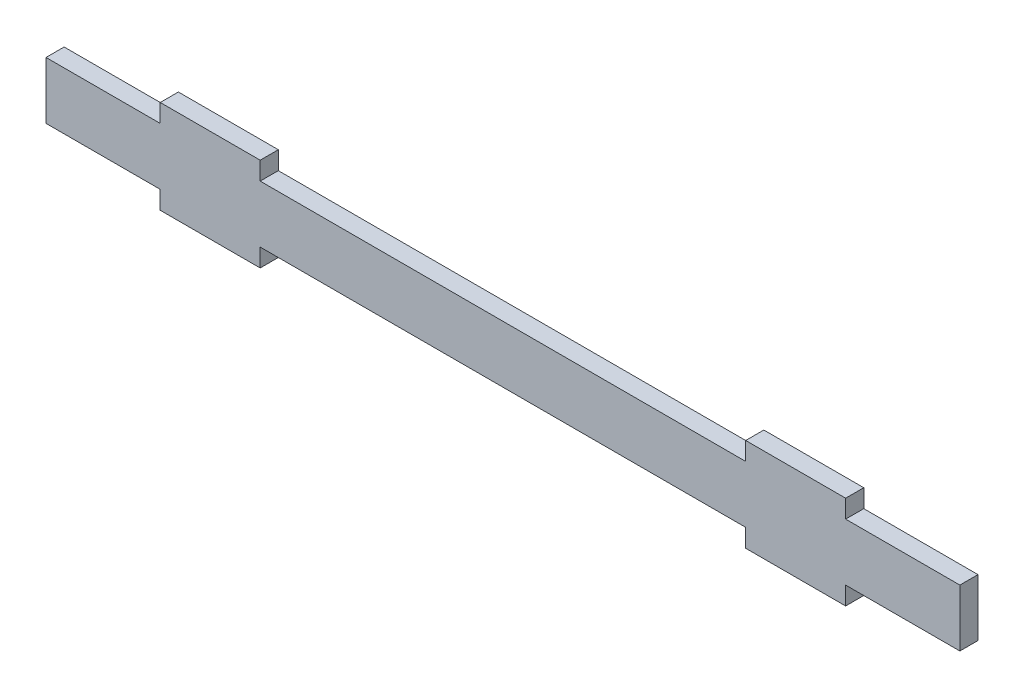
ISO-10303-21;
HEADER;
FILE_DESCRIPTION(('STEP AP214'),'2;1');
FILE_NAME('part.step','',(''),(''),'','','');
FILE_SCHEMA(('AUTOMOTIVE_DESIGN { 1 0 10303 214 1 1 1 1 }'));
ENDSEC;
DATA;
#1=APPLICATION_CONTEXT('core data for automotive mechanical design processes');
#2=APPLICATION_PROTOCOL_DEFINITION('international standard','automotive_design',2000,#1);
#3=PRODUCT_CONTEXT('',#1,'mechanical');
#4=PRODUCT('Part','Part','',(#3));
#5=PRODUCT_RELATED_PRODUCT_CATEGORY('part','',(#4));
#6=PRODUCT_DEFINITION_FORMATION('','',#4);
#7=PRODUCT_DEFINITION_CONTEXT('part definition',#1,'design');
#8=PRODUCT_DEFINITION('design','',#6,#7);
#9=PRODUCT_DEFINITION_SHAPE('','',#8);
#10=(LENGTH_UNIT() NAMED_UNIT(*) SI_UNIT(.MILLI.,.METRE.));
#11=(NAMED_UNIT(*) PLANE_ANGLE_UNIT() SI_UNIT($,.RADIAN.));
#12=(NAMED_UNIT(*) SI_UNIT($,.STERADIAN.) SOLID_ANGLE_UNIT());
#13=UNCERTAINTY_MEASURE_WITH_UNIT(LENGTH_MEASURE(1.E-05),#10,'distance_accuracy_value','');
#14=(GEOMETRIC_REPRESENTATION_CONTEXT(3) GLOBAL_UNCERTAINTY_ASSIGNED_CONTEXT((#13)) GLOBAL_UNIT_ASSIGNED_CONTEXT((#10,
#11,#12)) REPRESENTATION_CONTEXT('',''));
#15=CARTESIAN_POINT('',(0.,0.,0.));
#16=DIRECTION('',(0.,0.,1.));
#17=DIRECTION('',(1.,0.,0.));
#18=AXIS2_PLACEMENT_3D('',#15,#16,#17);
#19=CARTESIAN_POINT('',(-160.,-4.99999999999996,6.35));
#20=DIRECTION('',(1.,0.,0.));
#21=DIRECTION('',(0.,0.,-1.));
#22=AXIS2_PLACEMENT_3D('',#19,#20,#21);
#23=PLANE('',#22);
#24=DIRECTION('',(0.,-1.,0.));
#25=VECTOR('',#24,1.);
#26=CARTESIAN_POINT('',(-160.,-4.99999999999996,0.));
#27=LINE('',#26,#25);
#28=CARTESIAN_POINT('',(-160.,14.9999999999999,0.));
#29=VERTEX_POINT('',#28);
#30=CARTESIAN_POINT('',(-160.,-4.99999999999996,0.));
#31=VERTEX_POINT('',#30);
#32=EDGE_CURVE('E201',#29,#31,#27,.T.);
#33=ORIENTED_EDGE('',*,*,#32,.T.);
#34=DIRECTION('',(0.,0.,-1.));
#35=VECTOR('',#34,1.);
#36=CARTESIAN_POINT('',(-160.,-4.99999999999996,6.35));
#37=LINE('',#36,#35);
#38=CARTESIAN_POINT('',(-160.,-4.99999999999996,6.35));
#39=VERTEX_POINT('',#38);
#40=EDGE_CURVE('E11',#39,#31,#37,.T.);
#41=ORIENTED_EDGE('',*,*,#40,.F.);
#42=DIRECTION('',(0.,-1.,0.));
#43=VECTOR('',#42,1.);
#44=CARTESIAN_POINT('',(-160.,-4.99999999999996,6.35));
#45=LINE('',#44,#43);
#46=CARTESIAN_POINT('',(-160.,14.9999999999999,6.35));
#47=VERTEX_POINT('',#46);
#48=EDGE_CURVE('E239',#47,#39,#45,.T.);
#49=ORIENTED_EDGE('',*,*,#48,.F.);
#50=DIRECTION('',(0.,0.,-1.));
#51=VECTOR('',#50,1.);
#52=CARTESIAN_POINT('',(-160.,14.9999999999999,6.35));
#53=LINE('',#52,#51);
#54=EDGE_CURVE('E197',#47,#29,#53,.T.);
#55=ORIENTED_EDGE('',*,*,#54,.T.);
#56=EDGE_LOOP('',(#33,#41,#49,#55));
#57=FACE_BOUND('',#56,.T.);
#58=ADVANCED_FACE('F33',(#57),#23,.F.);
#59=CARTESIAN_POINT('',(-160.,-4.99999999999996,6.35));
#60=DIRECTION('',(0.,1.,0.));
#61=DIRECTION('',(0.,0.,1.));
#62=AXIS2_PLACEMENT_3D('',#59,#60,#61);
#63=PLANE('',#62);
#64=DIRECTION('',(1.,0.,0.));
#65=VECTOR('',#64,1.);
#66=CARTESIAN_POINT('',(-160.,-4.99999999999996,0.));
#67=LINE('',#66,#65);
#68=CARTESIAN_POINT('',(-120.,-4.99999999999996,0.));
#69=VERTEX_POINT('',#68);
#70=EDGE_CURVE('E204',#31,#69,#67,.T.);
#71=ORIENTED_EDGE('',*,*,#70,.T.);
#72=DIRECTION('',(0.,0.,-1.));
#73=VECTOR('',#72,1.);
#74=CARTESIAN_POINT('',(-120.,-4.99999999999996,6.35));
#75=LINE('',#74,#73);
#76=CARTESIAN_POINT('',(-120.,-4.99999999999996,6.35));
#77=VERTEX_POINT('',#76);
#78=EDGE_CURVE('E41',#77,#69,#75,.T.);
#79=ORIENTED_EDGE('',*,*,#78,.F.);
#80=DIRECTION('',(1.,0.,0.));
#81=VECTOR('',#80,1.);
#82=CARTESIAN_POINT('',(-160.,-4.99999999999996,6.35));
#83=LINE('',#82,#81);
#84=EDGE_CURVE('E128',#39,#77,#83,.T.);
#85=ORIENTED_EDGE('',*,*,#84,.F.);
#86=ORIENTED_EDGE('',*,*,#40,.T.);
#87=EDGE_LOOP('',(#71,#79,#85,#86));
#88=FACE_BOUND('',#87,.T.);
#89=ADVANCED_FACE('F357',(#88),#63,.F.);
#90=CARTESIAN_POINT('',(-120.,-11.35,6.35));
#91=DIRECTION('',(1.,0.,0.));
#92=DIRECTION('',(0.,0.,-1.));
#93=AXIS2_PLACEMENT_3D('',#90,#91,#92);
#94=PLANE('',#93);
#95=DIRECTION('',(0.,-1.,0.));
#96=VECTOR('',#95,1.);
#97=CARTESIAN_POINT('',(-120.,-11.35,0.));
#98=LINE('',#97,#96);
#99=CARTESIAN_POINT('',(-120.,-11.35,0.));
#100=VERTEX_POINT('',#99);
#101=EDGE_CURVE('E206',#69,#100,#98,.T.);
#102=ORIENTED_EDGE('',*,*,#101,.T.);
#103=DIRECTION('',(0.,0.,-1.));
#104=VECTOR('',#103,1.);
#105=CARTESIAN_POINT('',(-120.,-11.35,6.35));
#106=LINE('',#105,#104);
#107=CARTESIAN_POINT('',(-120.,-11.35,6.35));
#108=VERTEX_POINT('',#107);
#109=EDGE_CURVE('E282',#108,#100,#106,.T.);
#110=ORIENTED_EDGE('',*,*,#109,.F.);
#111=DIRECTION('',(0.,-1.,0.));
#112=VECTOR('',#111,1.);
#113=CARTESIAN_POINT('',(-120.,-11.35,6.35));
#114=LINE('',#113,#112);
#115=EDGE_CURVE('E290',#77,#108,#114,.T.);
#116=ORIENTED_EDGE('',*,*,#115,.F.);
#117=ORIENTED_EDGE('',*,*,#78,.T.);
#118=EDGE_LOOP('',(#102,#110,#116,#117));
#119=FACE_BOUND('',#118,.T.);
#120=ADVANCED_FACE('F288',(#119),#94,.F.);
#121=CARTESIAN_POINT('',(-85.,-11.35,6.35));
#122=DIRECTION('',(0.,1.,0.));
#123=DIRECTION('',(-1.,0.,0.));
#124=AXIS2_PLACEMENT_3D('',#121,#122,#123);
#125=PLANE('',#124);
#126=DIRECTION('',(1.,0.,0.));
#127=VECTOR('',#126,1.);
#128=CARTESIAN_POINT('',(-85.,-11.35,0.));
#129=LINE('',#128,#127);
#130=CARTESIAN_POINT('',(-85.,-11.35,0.));
#131=VERTEX_POINT('',#130);
#132=EDGE_CURVE('E208',#100,#131,#129,.T.);
#133=ORIENTED_EDGE('',*,*,#132,.T.);
#134=DIRECTION('',(0.,0.,-1.));
#135=VECTOR('',#134,1.);
#136=CARTESIAN_POINT('',(-85.,-11.35,6.35));
#137=LINE('',#136,#135);
#138=CARTESIAN_POINT('',(-85.,-11.35,6.35));
#139=VERTEX_POINT('',#138);
#140=EDGE_CURVE('E279',#139,#131,#137,.T.);
#141=ORIENTED_EDGE('',*,*,#140,.F.);
#142=DIRECTION('',(1.,0.,0.));
#143=VECTOR('',#142,1.);
#144=CARTESIAN_POINT('',(-85.,-11.35,6.35));
#145=LINE('',#144,#143);
#146=EDGE_CURVE('E308',#108,#139,#145,.T.);
#147=ORIENTED_EDGE('',*,*,#146,.F.);
#148=ORIENTED_EDGE('',*,*,#109,.T.);
#149=EDGE_LOOP('',(#133,#141,#147,#148));
#150=FACE_BOUND('',#149,.T.);
#151=ADVANCED_FACE('F299',(#150),#125,.F.);
#152=CARTESIAN_POINT('',(-85.,-4.99999999999996,6.35));
#153=DIRECTION('',(-1.,0.,0.));
#154=DIRECTION('',(0.,0.,1.));
#155=AXIS2_PLACEMENT_3D('',#152,#153,#154);
#156=PLANE('',#155);
#157=DIRECTION('',(0.,1.,0.));
#158=VECTOR('',#157,1.);
#159=CARTESIAN_POINT('',(-85.,-4.99999999999996,0.));
#160=LINE('',#159,#158);
#161=CARTESIAN_POINT('',(-85.,-4.99999999999996,0.));
#162=VERTEX_POINT('',#161);
#163=EDGE_CURVE('E210',#131,#162,#160,.T.);
#164=ORIENTED_EDGE('',*,*,#163,.T.);
#165=DIRECTION('',(0.,0.,-1.));
#166=VECTOR('',#165,1.);
#167=CARTESIAN_POINT('',(-85.,-4.99999999999996,6.35));
#168=LINE('',#167,#166);
#169=CARTESIAN_POINT('',(-85.,-4.99999999999996,6.35));
#170=VERTEX_POINT('',#169);
#171=EDGE_CURVE('E276',#170,#162,#168,.T.);
#172=ORIENTED_EDGE('',*,*,#171,.F.);
#173=DIRECTION('',(0.,1.,0.));
#174=VECTOR('',#173,1.);
#175=CARTESIAN_POINT('',(-85.,-4.99999999999996,6.35));
#176=LINE('',#175,#174);
#177=EDGE_CURVE('E305',#139,#170,#176,.T.);
#178=ORIENTED_EDGE('',*,*,#177,.F.);
#179=ORIENTED_EDGE('',*,*,#140,.T.);
#180=EDGE_LOOP('',(#164,#172,#178,#179));
#181=FACE_BOUND('',#180,.T.);
#182=ADVANCED_FACE('F303',(#181),#156,.F.);
#183=CARTESIAN_POINT('',(-85.,-4.99999999999996,6.35));
#184=DIRECTION('',(0.,1.,0.));
#185=DIRECTION('',(0.,0.,1.));
#186=AXIS2_PLACEMENT_3D('',#183,#184,#185);
#187=PLANE('',#186);
#188=DIRECTION('',(1.,0.,0.));
#189=VECTOR('',#188,1.);
#190=CARTESIAN_POINT('',(-85.,-4.99999999999996,0.));
#191=LINE('',#190,#189);
#192=CARTESIAN_POINT('',(85.,-4.99999999999996,0.));
#193=VERTEX_POINT('',#192);
#194=EDGE_CURVE('E212',#162,#193,#191,.T.);
#195=ORIENTED_EDGE('',*,*,#194,.T.);
#196=DIRECTION('',(0.,0.,-1.));
#197=VECTOR('',#196,1.);
#198=CARTESIAN_POINT('',(85.,-4.99999999999996,6.35));
#199=LINE('',#198,#197);
#200=CARTESIAN_POINT('',(85.,-4.99999999999996,6.35));
#201=VERTEX_POINT('',#200);
#202=EDGE_CURVE('E273',#201,#193,#199,.T.);
#203=ORIENTED_EDGE('',*,*,#202,.F.);
#204=DIRECTION('',(1.,0.,0.));
#205=VECTOR('',#204,1.);
#206=CARTESIAN_POINT('',(-85.,-4.99999999999996,6.35));
#207=LINE('',#206,#205);
#208=EDGE_CURVE('E307',#170,#201,#207,.T.);
#209=ORIENTED_EDGE('',*,*,#208,.F.);
#210=ORIENTED_EDGE('',*,*,#171,.T.);
#211=EDGE_LOOP('',(#195,#203,#209,#210));
#212=FACE_BOUND('',#211,.T.);
#213=ADVANCED_FACE('F370',(#212),#187,.F.);
#214=CARTESIAN_POINT('',(85.,-4.99999999999996,6.35));
#215=DIRECTION('',(1.,0.,0.));
#216=DIRECTION('',(0.,0.,-1.));
#217=AXIS2_PLACEMENT_3D('',#214,#215,#216);
#218=PLANE('',#217);
#219=DIRECTION('',(0.,-1.,0.));
#220=VECTOR('',#219,1.);
#221=CARTESIAN_POINT('',(85.,-4.99999999999996,0.));
#222=LINE('',#221,#220);
#223=CARTESIAN_POINT('',(85.,-11.35,0.));
#224=VERTEX_POINT('',#223);
#225=EDGE_CURVE('E214',#193,#224,#222,.T.);
#226=ORIENTED_EDGE('',*,*,#225,.T.);
#227=DIRECTION('',(0.,0.,-1.));
#228=VECTOR('',#227,1.);
#229=CARTESIAN_POINT('',(85.,-11.35,6.35));
#230=LINE('',#229,#228);
#231=CARTESIAN_POINT('',(85.,-11.35,6.35));
#232=VERTEX_POINT('',#231);
#233=EDGE_CURVE('E270',#232,#224,#230,.T.);
#234=ORIENTED_EDGE('',*,*,#233,.F.);
#235=DIRECTION('',(0.,-1.,0.));
#236=VECTOR('',#235,1.);
#237=CARTESIAN_POINT('',(85.,-4.99999999999996,6.35));
#238=LINE('',#237,#236);
#239=EDGE_CURVE('E310',#201,#232,#238,.T.);
#240=ORIENTED_EDGE('',*,*,#239,.F.);
#241=ORIENTED_EDGE('',*,*,#202,.T.);
#242=EDGE_LOOP('',(#226,#234,#240,#241));
#243=FACE_BOUND('',#242,.T.);
#244=ADVANCED_FACE('F373',(#243),#218,.F.);
#245=CARTESIAN_POINT('',(85.,-11.35,6.35));
#246=DIRECTION('',(0.,1.,0.));
#247=DIRECTION('',(-1.,0.,0.));
#248=AXIS2_PLACEMENT_3D('',#245,#246,#247);
#249=PLANE('',#248);
#250=DIRECTION('',(1.,0.,0.));
#251=VECTOR('',#250,1.);
#252=CARTESIAN_POINT('',(85.,-11.35,0.));
#253=LINE('',#252,#251);
#254=CARTESIAN_POINT('',(120.,-11.35,0.));
#255=VERTEX_POINT('',#254);
#256=EDGE_CURVE('E216',#224,#255,#253,.T.);
#257=ORIENTED_EDGE('',*,*,#256,.T.);
#258=DIRECTION('',(0.,0.,-1.));
#259=VECTOR('',#258,1.);
#260=CARTESIAN_POINT('',(120.,-11.35,6.35));
#261=LINE('',#260,#259);
#262=CARTESIAN_POINT('',(120.,-11.35,6.35));
#263=VERTEX_POINT('',#262);
#264=EDGE_CURVE('E267',#263,#255,#261,.T.);
#265=ORIENTED_EDGE('',*,*,#264,.F.);
#266=DIRECTION('',(1.,0.,0.));
#267=VECTOR('',#266,1.);
#268=CARTESIAN_POINT('',(85.,-11.35,6.35));
#269=LINE('',#268,#267);
#270=EDGE_CURVE('E316',#232,#263,#269,.T.);
#271=ORIENTED_EDGE('',*,*,#270,.F.);
#272=ORIENTED_EDGE('',*,*,#233,.T.);
#273=EDGE_LOOP('',(#257,#265,#271,#272));
#274=FACE_BOUND('',#273,.T.);
#275=ADVANCED_FACE('F377',(#274),#249,.F.);
#276=CARTESIAN_POINT('',(120.,-11.35,6.35));
#277=DIRECTION('',(-1.,0.,0.));
#278=DIRECTION('',(0.,0.,1.));
#279=AXIS2_PLACEMENT_3D('',#276,#277,#278);
#280=PLANE('',#279);
#281=DIRECTION('',(0.,1.,0.));
#282=VECTOR('',#281,1.);
#283=CARTESIAN_POINT('',(120.,-11.35,0.));
#284=LINE('',#283,#282);
#285=CARTESIAN_POINT('',(120.,-4.99999999999996,0.));
#286=VERTEX_POINT('',#285);
#287=EDGE_CURVE('E218',#255,#286,#284,.T.);
#288=ORIENTED_EDGE('',*,*,#287,.T.);
#289=DIRECTION('',(0.,0.,-1.));
#290=VECTOR('',#289,1.);
#291=CARTESIAN_POINT('',(120.,-4.99999999999996,6.35));
#292=LINE('',#291,#290);
#293=CARTESIAN_POINT('',(120.,-4.99999999999996,6.35));
#294=VERTEX_POINT('',#293);
#295=EDGE_CURVE('E264',#294,#286,#292,.T.);
#296=ORIENTED_EDGE('',*,*,#295,.F.);
#297=DIRECTION('',(0.,1.,0.));
#298=VECTOR('',#297,1.);
#299=CARTESIAN_POINT('',(120.,-11.35,6.35));
#300=LINE('',#299,#298);
#301=EDGE_CURVE('E318',#263,#294,#300,.T.);
#302=ORIENTED_EDGE('',*,*,#301,.F.);
#303=ORIENTED_EDGE('',*,*,#264,.T.);
#304=EDGE_LOOP('',(#288,#296,#302,#303));
#305=FACE_BOUND('',#304,.T.);
#306=ADVANCED_FACE('F381',(#305),#280,.F.);
#307=CARTESIAN_POINT('',(120.,-4.99999999999996,6.35));
#308=DIRECTION('',(0.,1.,0.));
#309=DIRECTION('',(-1.,0.,0.));
#310=AXIS2_PLACEMENT_3D('',#307,#308,#309);
#311=PLANE('',#310);
#312=DIRECTION('',(1.,0.,0.));
#313=VECTOR('',#312,1.);
#314=CARTESIAN_POINT('',(120.,-4.99999999999996,0.));
#315=LINE('',#314,#313);
#316=CARTESIAN_POINT('',(160.,-5.00000000000005,0.));
#317=VERTEX_POINT('',#316);
#318=EDGE_CURVE('E220',#286,#317,#315,.T.);
#319=ORIENTED_EDGE('',*,*,#318,.T.);
#320=DIRECTION('',(0.,0.,-1.));
#321=VECTOR('',#320,1.);
#322=CARTESIAN_POINT('',(160.,-5.00000000000005,6.35));
#323=LINE('',#322,#321);
#324=CARTESIAN_POINT('',(160.,-5.00000000000005,6.35));
#325=VERTEX_POINT('',#324);
#326=EDGE_CURVE('E261',#325,#317,#323,.T.);
#327=ORIENTED_EDGE('',*,*,#326,.F.);
#328=DIRECTION('',(1.,0.,0.));
#329=VECTOR('',#328,1.);
#330=CARTESIAN_POINT('',(120.,-4.99999999999996,6.35));
#331=LINE('',#330,#329);
#332=EDGE_CURVE('E320',#294,#325,#331,.T.);
#333=ORIENTED_EDGE('',*,*,#332,.F.);
#334=ORIENTED_EDGE('',*,*,#295,.T.);
#335=EDGE_LOOP('',(#319,#327,#333,#334));
#336=FACE_BOUND('',#335,.T.);
#337=ADVANCED_FACE('F385',(#336),#311,.F.);
#338=CARTESIAN_POINT('',(160.,-5.00000000000005,6.35));
#339=DIRECTION('',(-1.,0.,0.));
#340=DIRECTION('',(0.,0.,1.));
#341=AXIS2_PLACEMENT_3D('',#338,#339,#340);
#342=PLANE('',#341);
#343=DIRECTION('',(0.,1.,0.));
#344=VECTOR('',#343,1.);
#345=CARTESIAN_POINT('',(160.,-5.00000000000005,0.));
#346=LINE('',#345,#344);
#347=CARTESIAN_POINT('',(160.,15.,0.));
#348=VERTEX_POINT('',#347);
#349=EDGE_CURVE('E222',#317,#348,#346,.T.);
#350=ORIENTED_EDGE('',*,*,#349,.T.);
#351=DIRECTION('',(0.,0.,-1.));
#352=VECTOR('',#351,1.);
#353=CARTESIAN_POINT('',(160.,15.,6.35));
#354=LINE('',#353,#352);
#355=CARTESIAN_POINT('',(160.,15.,6.35));
#356=VERTEX_POINT('',#355);
#357=EDGE_CURVE('E258',#356,#348,#354,.T.);
#358=ORIENTED_EDGE('',*,*,#357,.F.);
#359=DIRECTION('',(0.,1.,0.));
#360=VECTOR('',#359,1.);
#361=CARTESIAN_POINT('',(160.,-5.00000000000005,6.35));
#362=LINE('',#361,#360);
#363=EDGE_CURVE('E322',#325,#356,#362,.T.);
#364=ORIENTED_EDGE('',*,*,#363,.F.);
#365=ORIENTED_EDGE('',*,*,#326,.T.);
#366=EDGE_LOOP('',(#350,#358,#364,#365));
#367=FACE_BOUND('',#366,.T.);
#368=ADVANCED_FACE('F389',(#367),#342,.F.);
#369=CARTESIAN_POINT('',(120.,14.9999999999999,6.35));
#370=DIRECTION('',(0.,-1.,0.));
#371=DIRECTION('',(1.,0.,0.));
#372=AXIS2_PLACEMENT_3D('',#369,#370,#371);
#373=PLANE('',#372);
#374=DIRECTION('',(-1.,0.,0.));
#375=VECTOR('',#374,1.);
#376=CARTESIAN_POINT('',(120.,14.9999999999999,0.));
#377=LINE('',#376,#375);
#378=CARTESIAN_POINT('',(120.,14.9999999999999,0.));
#379=VERTEX_POINT('',#378);
#380=EDGE_CURVE('E224',#348,#379,#377,.T.);
#381=ORIENTED_EDGE('',*,*,#380,.T.);
#382=DIRECTION('',(0.,0.,-1.));
#383=VECTOR('',#382,1.);
#384=CARTESIAN_POINT('',(120.,14.9999999999999,6.35));
#385=LINE('',#384,#383);
#386=CARTESIAN_POINT('',(120.,14.9999999999999,6.35));
#387=VERTEX_POINT('',#386);
#388=EDGE_CURVE('E255',#387,#379,#385,.T.);
#389=ORIENTED_EDGE('',*,*,#388,.F.);
#390=DIRECTION('',(-1.,0.,0.));
#391=VECTOR('',#390,1.);
#392=CARTESIAN_POINT('',(120.,14.9999999999999,6.35));
#393=LINE('',#392,#391);
#394=EDGE_CURVE('E324',#356,#387,#393,.T.);
#395=ORIENTED_EDGE('',*,*,#394,.F.);
#396=ORIENTED_EDGE('',*,*,#357,.T.);
#397=EDGE_LOOP('',(#381,#389,#395,#396));
#398=FACE_BOUND('',#397,.T.);
#399=ADVANCED_FACE('F393',(#398),#373,.F.);
#400=CARTESIAN_POINT('',(120.,21.3499999999999,6.35));
#401=DIRECTION('',(-1.,0.,0.));
#402=DIRECTION('',(0.,0.,1.));
#403=AXIS2_PLACEMENT_3D('',#400,#401,#402);
#404=PLANE('',#403);
#405=DIRECTION('',(0.,1.,0.));
#406=VECTOR('',#405,1.);
#407=CARTESIAN_POINT('',(120.,21.3499999999999,0.));
#408=LINE('',#407,#406);
#409=CARTESIAN_POINT('',(120.,21.3499999999999,0.));
#410=VERTEX_POINT('',#409);
#411=EDGE_CURVE('E226',#379,#410,#408,.T.);
#412=ORIENTED_EDGE('',*,*,#411,.T.);
#413=DIRECTION('',(0.,0.,-1.));
#414=VECTOR('',#413,1.);
#415=CARTESIAN_POINT('',(120.,21.3499999999999,6.35));
#416=LINE('',#415,#414);
#417=CARTESIAN_POINT('',(120.,21.3499999999999,6.35));
#418=VERTEX_POINT('',#417);
#419=EDGE_CURVE('E252',#418,#410,#416,.T.);
#420=ORIENTED_EDGE('',*,*,#419,.F.);
#421=DIRECTION('',(0.,1.,0.));
#422=VECTOR('',#421,1.);
#423=CARTESIAN_POINT('',(120.,21.3499999999999,6.35));
#424=LINE('',#423,#422);
#425=EDGE_CURVE('E326',#387,#418,#424,.T.);
#426=ORIENTED_EDGE('',*,*,#425,.F.);
#427=ORIENTED_EDGE('',*,*,#388,.T.);
#428=EDGE_LOOP('',(#412,#420,#426,#427));
#429=FACE_BOUND('',#428,.T.);
#430=ADVANCED_FACE('F397',(#429),#404,.F.);
#431=CARTESIAN_POINT('',(85.,21.3499999999999,6.35));
#432=DIRECTION('',(0.,-1.,0.));
#433=DIRECTION('',(1.,0.,0.));
#434=AXIS2_PLACEMENT_3D('',#431,#432,#433);
#435=PLANE('',#434);
#436=DIRECTION('',(-1.,0.,0.));
#437=VECTOR('',#436,1.);
#438=CARTESIAN_POINT('',(85.,21.3499999999999,0.));
#439=LINE('',#438,#437);
#440=CARTESIAN_POINT('',(85.,21.3499999999999,0.));
#441=VERTEX_POINT('',#440);
#442=EDGE_CURVE('E228',#410,#441,#439,.T.);
#443=ORIENTED_EDGE('',*,*,#442,.T.);
#444=DIRECTION('',(0.,0.,-1.));
#445=VECTOR('',#444,1.);
#446=CARTESIAN_POINT('',(85.,21.3499999999999,6.35));
#447=LINE('',#446,#445);
#448=CARTESIAN_POINT('',(85.,21.3499999999999,6.35));
#449=VERTEX_POINT('',#448);
#450=EDGE_CURVE('E249',#449,#441,#447,.T.);
#451=ORIENTED_EDGE('',*,*,#450,.F.);
#452=DIRECTION('',(-1.,0.,0.));
#453=VECTOR('',#452,1.);
#454=CARTESIAN_POINT('',(85.,21.3499999999999,6.35));
#455=LINE('',#454,#453);
#456=EDGE_CURVE('E328',#418,#449,#455,.T.);
#457=ORIENTED_EDGE('',*,*,#456,.F.);
#458=ORIENTED_EDGE('',*,*,#419,.T.);
#459=EDGE_LOOP('',(#443,#451,#457,#458));
#460=FACE_BOUND('',#459,.T.);
#461=ADVANCED_FACE('F401',(#460),#435,.F.);
#462=CARTESIAN_POINT('',(85.,14.9999999999999,6.35));
#463=DIRECTION('',(1.,0.,0.));
#464=DIRECTION('',(0.,0.,-1.));
#465=AXIS2_PLACEMENT_3D('',#462,#463,#464);
#466=PLANE('',#465);
#467=DIRECTION('',(0.,-1.,0.));
#468=VECTOR('',#467,1.);
#469=CARTESIAN_POINT('',(85.,14.9999999999999,0.));
#470=LINE('',#469,#468);
#471=CARTESIAN_POINT('',(85.,14.9999999999999,0.));
#472=VERTEX_POINT('',#471);
#473=EDGE_CURVE('E230',#441,#472,#470,.T.);
#474=ORIENTED_EDGE('',*,*,#473,.T.);
#475=DIRECTION('',(0.,0.,-1.));
#476=VECTOR('',#475,1.);
#477=CARTESIAN_POINT('',(85.,14.9999999999999,6.35));
#478=LINE('',#477,#476);
#479=CARTESIAN_POINT('',(85.,14.9999999999999,6.35));
#480=VERTEX_POINT('',#479);
#481=EDGE_CURVE('E246',#480,#472,#478,.T.);
#482=ORIENTED_EDGE('',*,*,#481,.F.);
#483=DIRECTION('',(0.,-1.,0.));
#484=VECTOR('',#483,1.);
#485=CARTESIAN_POINT('',(85.,14.9999999999999,6.35));
#486=LINE('',#485,#484);
#487=EDGE_CURVE('E330',#449,#480,#486,.T.);
#488=ORIENTED_EDGE('',*,*,#487,.F.);
#489=ORIENTED_EDGE('',*,*,#450,.T.);
#490=EDGE_LOOP('',(#474,#482,#488,#489));
#491=FACE_BOUND('',#490,.T.);
#492=ADVANCED_FACE('F405',(#491),#466,.F.);
#493=CARTESIAN_POINT('',(-85.,14.9999999999999,6.35));
#494=DIRECTION('',(0.,-1.,0.));
#495=DIRECTION('',(0.,0.,-1.));
#496=AXIS2_PLACEMENT_3D('',#493,#494,#495);
#497=PLANE('',#496);
#498=DIRECTION('',(-1.,0.,0.));
#499=VECTOR('',#498,1.);
#500=CARTESIAN_POINT('',(-85.,14.9999999999999,0.));
#501=LINE('',#500,#499);
#502=CARTESIAN_POINT('',(-85.,14.9999999999999,0.));
#503=VERTEX_POINT('',#502);
#504=EDGE_CURVE('E232',#472,#503,#501,.T.);
#505=ORIENTED_EDGE('',*,*,#504,.T.);
#506=DIRECTION('',(0.,0.,-1.));
#507=VECTOR('',#506,1.);
#508=CARTESIAN_POINT('',(-85.,14.9999999999999,6.35));
#509=LINE('',#508,#507);
#510=CARTESIAN_POINT('',(-85.,14.9999999999999,6.35));
#511=VERTEX_POINT('',#510);
#512=EDGE_CURVE('E243',#511,#503,#509,.T.);
#513=ORIENTED_EDGE('',*,*,#512,.F.);
#514=DIRECTION('',(-1.,0.,0.));
#515=VECTOR('',#514,1.);
#516=CARTESIAN_POINT('',(-85.,14.9999999999999,6.35));
#517=LINE('',#516,#515);
#518=EDGE_CURVE('E332',#480,#511,#517,.T.);
#519=ORIENTED_EDGE('',*,*,#518,.F.);
#520=ORIENTED_EDGE('',*,*,#481,.T.);
#521=EDGE_LOOP('',(#505,#513,#519,#520));
#522=FACE_BOUND('',#521,.T.);
#523=ADVANCED_FACE('F338',(#522),#497,.F.);
#524=CARTESIAN_POINT('',(-85.,14.9999999999999,6.35));
#525=DIRECTION('',(-1.,0.,0.));
#526=DIRECTION('',(0.,0.,1.));
#527=AXIS2_PLACEMENT_3D('',#524,#525,#526);
#528=PLANE('',#527);
#529=DIRECTION('',(0.,1.,0.));
#530=VECTOR('',#529,1.);
#531=CARTESIAN_POINT('',(-85.,14.9999999999999,0.));
#532=LINE('',#531,#530);
#533=CARTESIAN_POINT('',(-85.,21.3499999999999,0.));
#534=VERTEX_POINT('',#533);
#535=EDGE_CURVE('E234',#503,#534,#532,.T.);
#536=ORIENTED_EDGE('',*,*,#535,.T.);
#537=DIRECTION('',(0.,0.,-1.));
#538=VECTOR('',#537,1.);
#539=CARTESIAN_POINT('',(-85.,21.3499999999999,6.35));
#540=LINE('',#539,#538);
#541=CARTESIAN_POINT('',(-85.,21.3499999999999,6.35));
#542=VERTEX_POINT('',#541);
#543=EDGE_CURVE('E192',#542,#534,#540,.T.);
#544=ORIENTED_EDGE('',*,*,#543,.F.);
#545=DIRECTION('',(0.,1.,0.));
#546=VECTOR('',#545,1.);
#547=CARTESIAN_POINT('',(-85.,14.9999999999999,6.35));
#548=LINE('',#547,#546);
#549=EDGE_CURVE('E183',#511,#542,#548,.T.);
#550=ORIENTED_EDGE('',*,*,#549,.F.);
#551=ORIENTED_EDGE('',*,*,#512,.T.);
#552=EDGE_LOOP('',(#536,#544,#550,#551));
#553=FACE_BOUND('',#552,.T.);
#554=ADVANCED_FACE('F342',(#553),#528,.F.);
#555=CARTESIAN_POINT('',(-85.,21.3499999999999,6.35));
#556=DIRECTION('',(0.,-1.,0.));
#557=DIRECTION('',(1.,0.,0.));
#558=AXIS2_PLACEMENT_3D('',#555,#556,#557);
#559=PLANE('',#558);
#560=DIRECTION('',(-1.,0.,0.));
#561=VECTOR('',#560,1.);
#562=CARTESIAN_POINT('',(-85.,21.3499999999999,0.));
#563=LINE('',#562,#561);
#564=CARTESIAN_POINT('',(-120.,21.3499999999999,0.));
#565=VERTEX_POINT('',#564);
#566=EDGE_CURVE('E191',#534,#565,#563,.T.);
#567=ORIENTED_EDGE('',*,*,#566,.T.);
#568=DIRECTION('',(0.,0.,-1.));
#569=VECTOR('',#568,1.);
#570=CARTESIAN_POINT('',(-120.,21.3499999999999,6.35));
#571=LINE('',#570,#569);
#572=CARTESIAN_POINT('',(-120.,21.3499999999999,6.35));
#573=VERTEX_POINT('',#572);
#574=EDGE_CURVE('E188',#573,#565,#571,.T.);
#575=ORIENTED_EDGE('',*,*,#574,.F.);
#576=DIRECTION('',(-1.,0.,0.));
#577=VECTOR('',#576,1.);
#578=CARTESIAN_POINT('',(-85.,21.3499999999999,6.35));
#579=LINE('',#578,#577);
#580=EDGE_CURVE('E177',#542,#573,#579,.T.);
#581=ORIENTED_EDGE('',*,*,#580,.F.);
#582=ORIENTED_EDGE('',*,*,#543,.T.);
#583=EDGE_LOOP('',(#567,#575,#581,#582));
#584=FACE_BOUND('',#583,.T.);
#585=ADVANCED_FACE('F189',(#584),#559,.F.);
#586=CARTESIAN_POINT('',(-120.,21.3499999999999,6.35));
#587=DIRECTION('',(1.,0.,0.));
#588=DIRECTION('',(0.,0.,-1.));
#589=AXIS2_PLACEMENT_3D('',#586,#587,#588);
#590=PLANE('',#589);
#591=DIRECTION('',(0.,-1.,0.));
#592=VECTOR('',#591,1.);
#593=CARTESIAN_POINT('',(-120.,21.3499999999999,0.));
#594=LINE('',#593,#592);
#595=CARTESIAN_POINT('',(-120.,14.9999999999999,0.));
#596=VERTEX_POINT('',#595);
#597=EDGE_CURVE('E114',#565,#596,#594,.T.);
#598=ORIENTED_EDGE('',*,*,#597,.T.);
#599=DIRECTION('',(0.,0.,-1.));
#600=VECTOR('',#599,1.);
#601=CARTESIAN_POINT('',(-120.,14.9999999999999,6.35));
#602=LINE('',#601,#600);
#603=CARTESIAN_POINT('',(-120.,14.9999999999999,6.35));
#604=VERTEX_POINT('',#603);
#605=EDGE_CURVE('E193',#604,#596,#602,.T.);
#606=ORIENTED_EDGE('',*,*,#605,.F.);
#607=DIRECTION('',(0.,-1.,0.));
#608=VECTOR('',#607,1.);
#609=CARTESIAN_POINT('',(-120.,21.3499999999999,6.35));
#610=LINE('',#609,#608);
#611=EDGE_CURVE('E181',#573,#604,#610,.T.);
#612=ORIENTED_EDGE('',*,*,#611,.F.);
#613=ORIENTED_EDGE('',*,*,#574,.T.);
#614=EDGE_LOOP('',(#598,#606,#612,#613));
#615=FACE_BOUND('',#614,.T.);
#616=ADVANCED_FACE('F195',(#615),#590,.F.);
#617=CARTESIAN_POINT('',(-160.,14.9999999999999,6.35));
#618=DIRECTION('',(0.,-1.,0.));
#619=DIRECTION('',(0.,0.,-1.));
#620=AXIS2_PLACEMENT_3D('',#617,#618,#619);
#621=PLANE('',#620);
#622=DIRECTION('',(-1.,0.,0.));
#623=VECTOR('',#622,1.);
#624=CARTESIAN_POINT('',(-160.,14.9999999999999,0.));
#625=LINE('',#624,#623);
#626=EDGE_CURVE('E120',#596,#29,#625,.T.);
#627=ORIENTED_EDGE('',*,*,#626,.T.);
#628=ORIENTED_EDGE('',*,*,#54,.F.);
#629=DIRECTION('',(-1.,0.,0.));
#630=VECTOR('',#629,1.);
#631=CARTESIAN_POINT('',(-160.,14.9999999999999,6.35));
#632=LINE('',#631,#630);
#633=EDGE_CURVE('E49',#604,#47,#632,.T.);
#634=ORIENTED_EDGE('',*,*,#633,.F.);
#635=ORIENTED_EDGE('',*,*,#605,.T.);
#636=EDGE_LOOP('',(#627,#628,#634,#635));
#637=FACE_BOUND('',#636,.T.);
#638=ADVANCED_FACE('F346',(#637),#621,.F.);
#639=CARTESIAN_POINT('',(0.,0.,6.35));
#640=DIRECTION('',(0.,0.,-1.));
#641=DIRECTION('',(-1.,0.,0.));
#642=AXIS2_PLACEMENT_3D('',#639,#640,#641);
#643=PLANE('',#642);
#644=ORIENTED_EDGE('',*,*,#48,.T.);
#645=ORIENTED_EDGE('',*,*,#84,.T.);
#646=ORIENTED_EDGE('',*,*,#115,.T.);
#647=ORIENTED_EDGE('',*,*,#146,.T.);
#648=ORIENTED_EDGE('',*,*,#177,.T.);
#649=ORIENTED_EDGE('',*,*,#208,.T.);
#650=ORIENTED_EDGE('',*,*,#239,.T.);
#651=ORIENTED_EDGE('',*,*,#270,.T.);
#652=ORIENTED_EDGE('',*,*,#301,.T.);
#653=ORIENTED_EDGE('',*,*,#332,.T.);
#654=ORIENTED_EDGE('',*,*,#363,.T.);
#655=ORIENTED_EDGE('',*,*,#394,.T.);
#656=ORIENTED_EDGE('',*,*,#425,.T.);
#657=ORIENTED_EDGE('',*,*,#456,.T.);
#658=ORIENTED_EDGE('',*,*,#487,.T.);
#659=ORIENTED_EDGE('',*,*,#518,.T.);
#660=ORIENTED_EDGE('',*,*,#549,.T.);
#661=ORIENTED_EDGE('',*,*,#580,.T.);
#662=ORIENTED_EDGE('',*,*,#611,.T.);
#663=ORIENTED_EDGE('',*,*,#633,.T.);
#664=EDGE_LOOP('',(#644,#645,#646,#647,#648,#649,#650,#651,#652,#653,#654,#655,#656,#657,#658,
#659,#660,#661,#662,#663));
#665=FACE_BOUND('',#664,.T.);
#666=ADVANCED_FACE('F179',(#665),#643,.F.);
#667=CARTESIAN_POINT('',(0.,0.,0.));
#668=DIRECTION('',(0.,0.,-1.));
#669=DIRECTION('',(-1.,0.,0.));
#670=AXIS2_PLACEMENT_3D('',#667,#668,#669);
#671=PLANE('',#670);
#672=ORIENTED_EDGE('',*,*,#32,.F.);
#673=ORIENTED_EDGE('',*,*,#626,.F.);
#674=ORIENTED_EDGE('',*,*,#597,.F.);
#675=ORIENTED_EDGE('',*,*,#566,.F.);
#676=ORIENTED_EDGE('',*,*,#535,.F.);
#677=ORIENTED_EDGE('',*,*,#504,.F.);
#678=ORIENTED_EDGE('',*,*,#473,.F.);
#679=ORIENTED_EDGE('',*,*,#442,.F.);
#680=ORIENTED_EDGE('',*,*,#411,.F.);
#681=ORIENTED_EDGE('',*,*,#380,.F.);
#682=ORIENTED_EDGE('',*,*,#349,.F.);
#683=ORIENTED_EDGE('',*,*,#318,.F.);
#684=ORIENTED_EDGE('',*,*,#287,.F.);
#685=ORIENTED_EDGE('',*,*,#256,.F.);
#686=ORIENTED_EDGE('',*,*,#225,.F.);
#687=ORIENTED_EDGE('',*,*,#194,.F.);
#688=ORIENTED_EDGE('',*,*,#163,.F.);
#689=ORIENTED_EDGE('',*,*,#132,.F.);
#690=ORIENTED_EDGE('',*,*,#101,.F.);
#691=ORIENTED_EDGE('',*,*,#70,.F.);
#692=EDGE_LOOP('',(#672,#673,#674,#675,#676,#677,#678,#679,#680,#681,#682,#683,#684,#685,#686,
#687,#688,#689,#690,#691));
#693=FACE_BOUND('',#692,.T.);
#694=ADVANCED_FACE('F294',(#693),#671,.T.);
#695=CLOSED_SHELL('',(#58,#89,#120,#151,#182,#213,#244,#275,#306,#337,#368,#399,#430,#461,#492,
#523,#554,#585,#616,#638,#666,#694));
#696=MANIFOLD_SOLID_BREP('B2',#695);
#697=ADVANCED_BREP_SHAPE_REPRESENTATION('',(#18,#696),#14);
#698=SHAPE_DEFINITION_REPRESENTATION(#9,#697);
ENDSEC;
END-ISO-10303-21;
